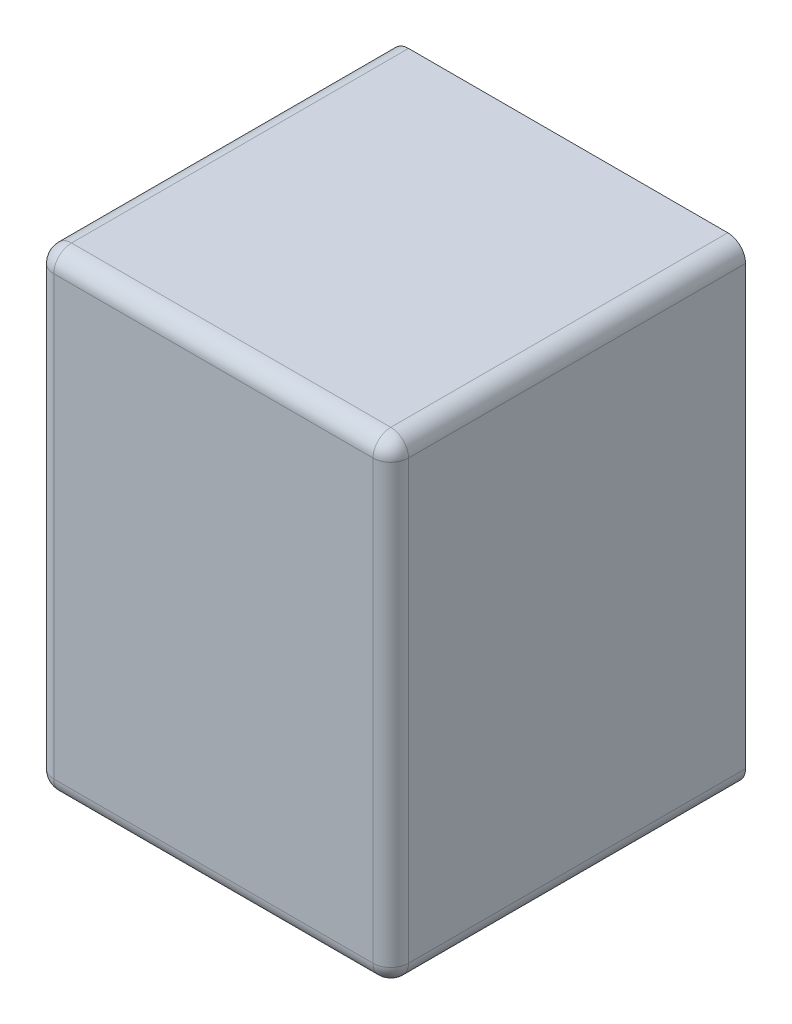
ISO-10303-21;
HEADER;
FILE_DESCRIPTION(('STEP AP214'),'2;1');
FILE_NAME('part.step','',(''),(''),'','','');
FILE_SCHEMA(('AUTOMOTIVE_DESIGN { 1 0 10303 214 1 1 1 1 }'));
ENDSEC;
DATA;
#1=APPLICATION_CONTEXT('core data for automotive mechanical design processes');
#2=APPLICATION_PROTOCOL_DEFINITION('international standard','automotive_design',2000,#1);
#3=PRODUCT_CONTEXT('',#1,'mechanical');
#4=PRODUCT('Part','Part','',(#3));
#5=PRODUCT_RELATED_PRODUCT_CATEGORY('part','',(#4));
#6=PRODUCT_DEFINITION_FORMATION('','',#4);
#7=PRODUCT_DEFINITION_CONTEXT('part definition',#1,'design');
#8=PRODUCT_DEFINITION('design','',#6,#7);
#9=PRODUCT_DEFINITION_SHAPE('','',#8);
#10=(LENGTH_UNIT() NAMED_UNIT(*) SI_UNIT(.MILLI.,.METRE.));
#11=(NAMED_UNIT(*) PLANE_ANGLE_UNIT() SI_UNIT($,.RADIAN.));
#12=(NAMED_UNIT(*) SI_UNIT($,.STERADIAN.) SOLID_ANGLE_UNIT());
#13=UNCERTAINTY_MEASURE_WITH_UNIT(LENGTH_MEASURE(1.E-05),#10,'distance_accuracy_value','');
#14=(GEOMETRIC_REPRESENTATION_CONTEXT(3) GLOBAL_UNCERTAINTY_ASSIGNED_CONTEXT((#13)) GLOBAL_UNIT_ASSIGNED_CONTEXT((#10,
#11,#12)) REPRESENTATION_CONTEXT('',''));
#15=CARTESIAN_POINT('',(0.,0.,0.));
#16=DIRECTION('',(0.,0.,1.));
#17=DIRECTION('',(1.,0.,0.));
#18=AXIS2_PLACEMENT_3D('',#15,#16,#17);
#19=CARTESIAN_POINT('',(1.35,-1.85,2.85));
#20=DIRECTION('',(0.,-1.,0.));
#21=DIRECTION('',(-1.,0.,0.));
#22=AXIS2_PLACEMENT_3D('',#19,#20,#21);
#23=SPHERICAL_SURFACE('',#22,0.15);
#24=CARTESIAN_POINT('',(1.35,-1.85,2.85));
#25=DIRECTION('',(0.,1.,0.));
#26=DIRECTION('',(0.,0.,1.));
#27=AXIS2_PLACEMENT_3D('',#24,#25,#26);
#28=CIRCLE('',#27,0.15);
#29=CARTESIAN_POINT('',(1.35,-1.85,3.));
#30=VERTEX_POINT('',#29);
#31=CARTESIAN_POINT('',(1.5,-1.85,2.84999999999923));
#32=VERTEX_POINT('',#31);
#33=EDGE_CURVE('E138',#30,#32,#28,.T.);
#34=ORIENTED_EDGE('',*,*,#33,.F.);
#35=CARTESIAN_POINT('',(1.35,-1.85,2.85));
#36=DIRECTION('',(1.,0.,0.));
#37=DIRECTION('',(0.,0.,-1.));
#38=AXIS2_PLACEMENT_3D('',#35,#36,#37);
#39=CIRCLE('',#38,0.15);
#40=CARTESIAN_POINT('',(1.35,-2.,2.85));
#41=VERTEX_POINT('',#40);
#42=EDGE_CURVE('E188',#41,#30,#39,.F.);
#43=ORIENTED_EDGE('',*,*,#42,.F.);
#44=CARTESIAN_POINT('',(1.35,-1.85,2.85));
#45=DIRECTION('',(0.,0.,1.));
#46=DIRECTION('',(1.,0.,0.));
#47=AXIS2_PLACEMENT_3D('',#44,#45,#46);
#48=CIRCLE('',#47,0.15);
#49=EDGE_CURVE('E97',#32,#41,#48,.F.);
#50=ORIENTED_EDGE('',*,*,#49,.F.);
#51=EDGE_LOOP('',(#34,#43,#50));
#52=FACE_BOUND('',#51,.T.);
#53=ADVANCED_FACE('F17',(#52),#23,.T.);
#54=CARTESIAN_POINT('',(1.5,-2.,0.));
#55=DIRECTION('',(1.,0.,0.));
#56=DIRECTION('',(0.,0.,-1.));
#57=AXIS2_PLACEMENT_3D('',#54,#55,#56);
#58=PLANE('',#57);
#59=DIRECTION('',(0.,0.,1.));
#60=VECTOR('',#59,1.);
#61=CARTESIAN_POINT('',(1.5,1.85,0.));
#62=LINE('',#61,#60);
#63=CARTESIAN_POINT('',(1.5,1.85,2.85));
#64=VERTEX_POINT('',#63);
#65=CARTESIAN_POINT('',(1.5,1.85,0.));
#66=VERTEX_POINT('',#65);
#67=EDGE_CURVE('E131',#64,#66,#62,.F.);
#68=ORIENTED_EDGE('',*,*,#67,.F.);
#69=DIRECTION('',(0.,1.,0.));
#70=VECTOR('',#69,1.);
#71=CARTESIAN_POINT('',(1.5,-1.85,2.85));
#72=LINE('',#71,#70);
#73=EDGE_CURVE('E134',#32,#64,#72,.T.);
#74=ORIENTED_EDGE('',*,*,#73,.F.);
#75=DIRECTION('',(0.,0.,1.));
#76=VECTOR('',#75,1.);
#77=CARTESIAN_POINT('',(1.5,-1.85,0.));
#78=LINE('',#77,#76);
#79=CARTESIAN_POINT('',(1.5,-1.85,0.));
#80=VERTEX_POINT('',#79);
#81=EDGE_CURVE('E129',#80,#32,#78,.T.);
#82=ORIENTED_EDGE('',*,*,#81,.F.);
#83=DIRECTION('',(0.,1.,0.));
#84=VECTOR('',#83,1.);
#85=CARTESIAN_POINT('',(1.5,-2.,0.));
#86=LINE('',#85,#84);
#87=EDGE_CURVE('E118',#80,#66,#86,.T.);
#88=ORIENTED_EDGE('',*,*,#87,.T.);
#89=EDGE_LOOP('',(#68,#74,#82,#88));
#90=FACE_BOUND('',#89,.T.);
#91=ADVANCED_FACE('F215',(#90),#58,.T.);
#92=CARTESIAN_POINT('',(1.35,1.85,2.85));
#93=DIRECTION('',(1.,0.,0.));
#94=DIRECTION('',(0.,-1.,0.));
#95=AXIS2_PLACEMENT_3D('',#92,#93,#94);
#96=SPHERICAL_SURFACE('',#95,0.15);
#97=CARTESIAN_POINT('',(1.35,1.85,2.85));
#98=DIRECTION('',(-1.,0.,0.));
#99=DIRECTION('',(0.,0.,1.));
#100=AXIS2_PLACEMENT_3D('',#97,#98,#99);
#101=CIRCLE('',#100,0.15);
#102=CARTESIAN_POINT('',(1.35,1.85,3.));
#103=VERTEX_POINT('',#102);
#104=CARTESIAN_POINT('',(1.35,2.,2.84999999999847));
#105=VERTEX_POINT('',#104);
#106=EDGE_CURVE('E182',#103,#105,#101,.T.);
#107=ORIENTED_EDGE('',*,*,#106,.F.);
#108=CARTESIAN_POINT('',(1.35,1.85,2.85));
#109=DIRECTION('',(0.,1.,0.));
#110=DIRECTION('',(0.,0.,1.));
#111=AXIS2_PLACEMENT_3D('',#108,#109,#110);
#112=CIRCLE('',#111,0.15);
#113=EDGE_CURVE('E137',#64,#103,#112,.F.);
#114=ORIENTED_EDGE('',*,*,#113,.F.);
#115=CARTESIAN_POINT('',(1.35,1.85,2.85));
#116=DIRECTION('',(0.,0.,1.));
#117=DIRECTION('',(1.,0.,0.));
#118=AXIS2_PLACEMENT_3D('',#115,#116,#117);
#119=CIRCLE('',#118,0.15);
#120=EDGE_CURVE('E142',#105,#64,#119,.F.);
#121=ORIENTED_EDGE('',*,*,#120,.F.);
#122=EDGE_LOOP('',(#107,#114,#121));
#123=FACE_BOUND('',#122,.T.);
#124=ADVANCED_FACE('F212',(#123),#96,.T.);
#125=CARTESIAN_POINT('',(1.35,-1.85,0.));
#126=DIRECTION('',(0.,0.,1.));
#127=DIRECTION('',(1.,0.,0.));
#128=AXIS2_PLACEMENT_3D('',#125,#126,#127);
#129=CYLINDRICAL_SURFACE('',#128,0.15);
#130=DIRECTION('',(0.,0.,1.));
#131=VECTOR('',#130,1.);
#132=CARTESIAN_POINT('',(1.35,-2.,0.));
#133=LINE('',#132,#131);
#134=CARTESIAN_POINT('',(1.35,-2.,0.));
#135=VERTEX_POINT('',#134);
#136=EDGE_CURVE('E92',#41,#135,#133,.F.);
#137=ORIENTED_EDGE('',*,*,#136,.T.);
#138=CARTESIAN_POINT('',(1.35,-1.85,0.));
#139=DIRECTION('',(0.,0.,1.));
#140=DIRECTION('',(1.,0.,0.));
#141=AXIS2_PLACEMENT_3D('',#138,#139,#140);
#142=CIRCLE('',#141,0.15);
#143=EDGE_CURVE('E21',#135,#80,#142,.T.);
#144=ORIENTED_EDGE('',*,*,#143,.T.);
#145=ORIENTED_EDGE('',*,*,#81,.T.);
#146=ORIENTED_EDGE('',*,*,#49,.T.);
#147=EDGE_LOOP('',(#137,#144,#145,#146));
#148=FACE_BOUND('',#147,.T.);
#149=ADVANCED_FACE('F94',(#148),#129,.T.);
#150=CARTESIAN_POINT('',(1.35,1.85,0.));
#151=DIRECTION('',(0.,0.,1.));
#152=DIRECTION('',(1.,0.,0.));
#153=AXIS2_PLACEMENT_3D('',#150,#151,#152);
#154=CYLINDRICAL_SURFACE('',#153,0.15);
#155=DIRECTION('',(0.,0.,1.));
#156=VECTOR('',#155,1.);
#157=CARTESIAN_POINT('',(1.35,2.,0.));
#158=LINE('',#157,#156);
#159=CARTESIAN_POINT('',(1.35,2.,0.));
#160=VERTEX_POINT('',#159);
#161=EDGE_CURVE('E149',#105,#160,#158,.F.);
#162=ORIENTED_EDGE('',*,*,#161,.F.);
#163=ORIENTED_EDGE('',*,*,#120,.T.);
#164=ORIENTED_EDGE('',*,*,#67,.T.);
#165=CARTESIAN_POINT('',(1.35,1.85,0.));
#166=DIRECTION('',(0.,0.,1.));
#167=DIRECTION('',(1.,0.,0.));
#168=AXIS2_PLACEMENT_3D('',#165,#166,#167);
#169=CIRCLE('',#168,0.15);
#170=EDGE_CURVE('E119',#66,#160,#169,.T.);
#171=ORIENTED_EDGE('',*,*,#170,.T.);
#172=EDGE_LOOP('',(#162,#163,#164,#171));
#173=FACE_BOUND('',#172,.T.);
#174=ADVANCED_FACE('F277',(#173),#154,.T.);
#175=CARTESIAN_POINT('',(-1.35,-1.85,2.85));
#176=DIRECTION('',(1.,0.,0.));
#177=DIRECTION('',(0.,0.,-1.));
#178=AXIS2_PLACEMENT_3D('',#175,#176,#177);
#179=CYLINDRICAL_SURFACE('',#178,0.15);
#180=ORIENTED_EDGE('',*,*,#42,.T.);
#181=DIRECTION('',(1.,0.,0.));
#182=VECTOR('',#181,1.);
#183=CARTESIAN_POINT('',(-1.5,-1.85,3.));
#184=LINE('',#183,#182);
#185=CARTESIAN_POINT('',(-1.35,-1.85,3.));
#186=VERTEX_POINT('',#185);
#187=EDGE_CURVE('E203',#186,#30,#184,.T.);
#188=ORIENTED_EDGE('',*,*,#187,.F.);
#189=CARTESIAN_POINT('',(-1.35,-1.85,2.85));
#190=DIRECTION('',(-1.,0.,0.));
#191=DIRECTION('',(0.,1.,0.));
#192=AXIS2_PLACEMENT_3D('',#189,#190,#191);
#193=CIRCLE('',#192,0.15);
#194=CARTESIAN_POINT('',(-1.35,-2.,2.84999999999962));
#195=VERTEX_POINT('',#194);
#196=EDGE_CURVE('E201',#195,#186,#193,.T.);
#197=ORIENTED_EDGE('',*,*,#196,.F.);
#198=DIRECTION('',(1.,0.,0.));
#199=VECTOR('',#198,1.);
#200=CARTESIAN_POINT('',(-1.5,-2.,2.85));
#201=LINE('',#200,#199);
#202=EDGE_CURVE('E102',#195,#41,#201,.T.);
#203=ORIENTED_EDGE('',*,*,#202,.T.);
#204=EDGE_LOOP('',(#180,#188,#197,#203));
#205=FACE_BOUND('',#204,.T.);
#206=ADVANCED_FACE('F290',(#205),#179,.T.);
#207=CARTESIAN_POINT('',(1.35,-1.85,2.85));
#208=DIRECTION('',(0.,1.,0.));
#209=DIRECTION('',(0.,0.,1.));
#210=AXIS2_PLACEMENT_3D('',#207,#208,#209);
#211=CYLINDRICAL_SURFACE('',#210,0.15);
#212=ORIENTED_EDGE('',*,*,#113,.T.);
#213=DIRECTION('',(0.,1.,0.));
#214=VECTOR('',#213,1.);
#215=CARTESIAN_POINT('',(1.35,-2.,3.));
#216=LINE('',#215,#214);
#217=EDGE_CURVE('E285',#30,#103,#216,.T.);
#218=ORIENTED_EDGE('',*,*,#217,.F.);
#219=ORIENTED_EDGE('',*,*,#33,.T.);
#220=ORIENTED_EDGE('',*,*,#73,.T.);
#221=EDGE_LOOP('',(#212,#218,#219,#220));
#222=FACE_BOUND('',#221,.T.);
#223=ADVANCED_FACE('F283',(#222),#211,.T.);
#224=CARTESIAN_POINT('',(1.35,1.85,2.85));
#225=DIRECTION('',(-1.,0.,0.));
#226=DIRECTION('',(0.,0.,1.));
#227=AXIS2_PLACEMENT_3D('',#224,#225,#226);
#228=CYLINDRICAL_SURFACE('',#227,0.15);
#229=CARTESIAN_POINT('',(-1.35,1.85,2.85));
#230=DIRECTION('',(1.,0.,0.));
#231=DIRECTION('',(0.,1.,0.));
#232=AXIS2_PLACEMENT_3D('',#229,#230,#231);
#233=CIRCLE('',#232,0.15);
#234=CARTESIAN_POINT('',(-1.35,1.85,3.));
#235=VERTEX_POINT('',#234);
#236=CARTESIAN_POINT('',(-1.35,2.,2.85));
#237=VERTEX_POINT('',#236);
#238=EDGE_CURVE('E148',#235,#237,#233,.F.);
#239=ORIENTED_EDGE('',*,*,#238,.F.);
#240=DIRECTION('',(1.,0.,0.));
#241=VECTOR('',#240,1.);
#242=CARTESIAN_POINT('',(-1.5,1.85,3.));
#243=LINE('',#242,#241);
#244=EDGE_CURVE('E179',#103,#235,#243,.F.);
#245=ORIENTED_EDGE('',*,*,#244,.F.);
#246=ORIENTED_EDGE('',*,*,#106,.T.);
#247=DIRECTION('',(1.,0.,0.));
#248=VECTOR('',#247,1.);
#249=CARTESIAN_POINT('',(-1.5,2.,2.85));
#250=LINE('',#249,#248);
#251=EDGE_CURVE('E257',#237,#105,#250,.T.);
#252=ORIENTED_EDGE('',*,*,#251,.F.);
#253=EDGE_LOOP('',(#239,#245,#246,#252));
#254=FACE_BOUND('',#253,.T.);
#255=ADVANCED_FACE('F271',(#254),#228,.T.);
#256=CARTESIAN_POINT('',(-1.5,-2.,0.));
#257=DIRECTION('',(0.,1.,0.));
#258=DIRECTION('',(0.,0.,1.));
#259=AXIS2_PLACEMENT_3D('',#256,#257,#258);
#260=PLANE('',#259);
#261=DIRECTION('',(0.,0.,1.));
#262=VECTOR('',#261,1.);
#263=CARTESIAN_POINT('',(-1.35,-2.,0.));
#264=LINE('',#263,#262);
#265=CARTESIAN_POINT('',(-1.35,-2.,0.));
#266=VERTEX_POINT('',#265);
#267=EDGE_CURVE('E108',#266,#195,#264,.T.);
#268=ORIENTED_EDGE('',*,*,#267,.F.);
#269=DIRECTION('',(1.,0.,0.));
#270=VECTOR('',#269,1.);
#271=CARTESIAN_POINT('',(-1.5,-2.,0.));
#272=LINE('',#271,#270);
#273=EDGE_CURVE('E105',#266,#135,#272,.T.);
#274=ORIENTED_EDGE('',*,*,#273,.T.);
#275=ORIENTED_EDGE('',*,*,#136,.F.);
#276=ORIENTED_EDGE('',*,*,#202,.F.);
#277=EDGE_LOOP('',(#268,#274,#275,#276));
#278=FACE_BOUND('',#277,.T.);
#279=ADVANCED_FACE('F106',(#278),#260,.F.);
#280=CARTESIAN_POINT('',(-1.5,-2.,0.));
#281=DIRECTION('',(0.,0.,1.));
#282=DIRECTION('',(1.,0.,0.));
#283=AXIS2_PLACEMENT_3D('',#280,#281,#282);
#284=PLANE('',#283);
#285=DIRECTION('',(1.,0.,0.));
#286=VECTOR('',#285,1.);
#287=CARTESIAN_POINT('',(-1.5,2.,0.));
#288=LINE('',#287,#286);
#289=CARTESIAN_POINT('',(-1.35,2.,0.));
#290=VERTEX_POINT('',#289);
#291=EDGE_CURVE('E112',#160,#290,#288,.F.);
#292=ORIENTED_EDGE('',*,*,#291,.F.);
#293=ORIENTED_EDGE('',*,*,#170,.F.);
#294=ORIENTED_EDGE('',*,*,#87,.F.);
#295=ORIENTED_EDGE('',*,*,#143,.F.);
#296=ORIENTED_EDGE('',*,*,#273,.F.);
#297=CARTESIAN_POINT('',(-1.35,-1.85,0.));
#298=DIRECTION('',(0.,0.,1.));
#299=DIRECTION('',(1.,0.,0.));
#300=AXIS2_PLACEMENT_3D('',#297,#298,#299);
#301=CIRCLE('',#300,0.15);
#302=CARTESIAN_POINT('',(-1.5,-1.85,0.));
#303=VERTEX_POINT('',#302);
#304=EDGE_CURVE('E101',#303,#266,#301,.T.);
#305=ORIENTED_EDGE('',*,*,#304,.F.);
#306=DIRECTION('',(0.,1.,0.));
#307=VECTOR('',#306,1.);
#308=CARTESIAN_POINT('',(-1.5,-2.,0.));
#309=LINE('',#308,#307);
#310=CARTESIAN_POINT('',(-1.5,1.85,0.));
#311=VERTEX_POINT('',#310);
#312=EDGE_CURVE('E158',#303,#311,#309,.T.);
#313=ORIENTED_EDGE('',*,*,#312,.T.);
#314=CARTESIAN_POINT('',(-1.35,1.85,0.));
#315=DIRECTION('',(0.,0.,1.));
#316=DIRECTION('',(1.,0.,0.));
#317=AXIS2_PLACEMENT_3D('',#314,#315,#316);
#318=CIRCLE('',#317,0.15);
#319=EDGE_CURVE('E145',#290,#311,#318,.T.);
#320=ORIENTED_EDGE('',*,*,#319,.F.);
#321=EDGE_LOOP('',(#292,#293,#294,#295,#296,#305,#313,#320));
#322=FACE_BOUND('',#321,.T.);
#323=ADVANCED_FACE('F115',(#322),#284,.F.);
#324=CARTESIAN_POINT('',(-1.5,2.,0.));
#325=DIRECTION('',(0.,1.,0.));
#326=DIRECTION('',(0.,0.,1.));
#327=AXIS2_PLACEMENT_3D('',#324,#325,#326);
#328=PLANE('',#327);
#329=ORIENTED_EDGE('',*,*,#291,.T.);
#330=DIRECTION('',(0.,0.,1.));
#331=VECTOR('',#330,1.);
#332=CARTESIAN_POINT('',(-1.35,2.,0.));
#333=LINE('',#332,#331);
#334=EDGE_CURVE('E168',#237,#290,#333,.F.);
#335=ORIENTED_EDGE('',*,*,#334,.F.);
#336=ORIENTED_EDGE('',*,*,#251,.T.);
#337=ORIENTED_EDGE('',*,*,#161,.T.);
#338=EDGE_LOOP('',(#329,#335,#336,#337));
#339=FACE_BOUND('',#338,.T.);
#340=ADVANCED_FACE('F265',(#339),#328,.T.);
#341=CARTESIAN_POINT('',(-1.35,1.85,2.85));
#342=DIRECTION('',(0.,1.,0.));
#343=DIRECTION('',(1.,0.,0.));
#344=AXIS2_PLACEMENT_3D('',#341,#342,#343);
#345=SPHERICAL_SURFACE('',#344,0.15);
#346=CARTESIAN_POINT('',(-1.35,1.85,2.85));
#347=DIRECTION('',(0.,-1.,0.));
#348=DIRECTION('',(0.,0.,-1.));
#349=AXIS2_PLACEMENT_3D('',#346,#347,#348);
#350=CIRCLE('',#349,0.15);
#351=CARTESIAN_POINT('',(-1.5,1.85,2.84999999999847));
#352=VERTEX_POINT('',#351);
#353=EDGE_CURVE('E35',#235,#352,#350,.T.);
#354=ORIENTED_EDGE('',*,*,#353,.F.);
#355=ORIENTED_EDGE('',*,*,#238,.T.);
#356=CARTESIAN_POINT('',(-1.35,1.85,2.85));
#357=DIRECTION('',(0.,0.,1.));
#358=DIRECTION('',(1.,0.,0.));
#359=AXIS2_PLACEMENT_3D('',#356,#357,#358);
#360=CIRCLE('',#359,0.15);
#361=EDGE_CURVE('E164',#352,#237,#360,.F.);
#362=ORIENTED_EDGE('',*,*,#361,.F.);
#363=EDGE_LOOP('',(#354,#355,#362));
#364=FACE_BOUND('',#363,.T.);
#365=ADVANCED_FACE('F246',(#364),#345,.T.);
#366=CARTESIAN_POINT('',(-1.35,-1.85,2.85));
#367=DIRECTION('',(-1.,0.,0.));
#368=DIRECTION('',(0.,1.,0.));
#369=AXIS2_PLACEMENT_3D('',#366,#367,#368);
#370=SPHERICAL_SURFACE('',#369,0.15);
#371=ORIENTED_EDGE('',*,*,#196,.T.);
#372=CARTESIAN_POINT('',(-1.35,-1.85,2.85));
#373=DIRECTION('',(0.,-1.,0.));
#374=DIRECTION('',(0.,0.,-1.));
#375=AXIS2_PLACEMENT_3D('',#372,#373,#374);
#376=CIRCLE('',#375,0.15);
#377=CARTESIAN_POINT('',(-1.5,-1.85,2.85));
#378=VERTEX_POINT('',#377);
#379=EDGE_CURVE('E297',#378,#186,#376,.F.);
#380=ORIENTED_EDGE('',*,*,#379,.F.);
#381=CARTESIAN_POINT('',(-1.35,-1.85,2.85));
#382=DIRECTION('',(0.,0.,1.));
#383=DIRECTION('',(1.,0.,0.));
#384=AXIS2_PLACEMENT_3D('',#381,#382,#383);
#385=CIRCLE('',#384,0.15);
#386=EDGE_CURVE('E165',#195,#378,#385,.F.);
#387=ORIENTED_EDGE('',*,*,#386,.F.);
#388=EDGE_LOOP('',(#371,#380,#387));
#389=FACE_BOUND('',#388,.T.);
#390=ADVANCED_FACE('F241',(#389),#370,.T.);
#391=CARTESIAN_POINT('',(-1.5,-2.,3.));
#392=DIRECTION('',(0.,0.,1.));
#393=DIRECTION('',(1.,0.,0.));
#394=AXIS2_PLACEMENT_3D('',#391,#392,#393);
#395=PLANE('',#394);
#396=ORIENTED_EDGE('',*,*,#244,.T.);
#397=DIRECTION('',(0.,-1.,0.));
#398=VECTOR('',#397,1.);
#399=CARTESIAN_POINT('',(-1.35,1.85,3.));
#400=LINE('',#399,#398);
#401=EDGE_CURVE('E175',#186,#235,#400,.F.);
#402=ORIENTED_EDGE('',*,*,#401,.F.);
#403=ORIENTED_EDGE('',*,*,#187,.T.);
#404=ORIENTED_EDGE('',*,*,#217,.T.);
#405=EDGE_LOOP('',(#396,#402,#403,#404));
#406=FACE_BOUND('',#405,.T.);
#407=ADVANCED_FACE('F238',(#406),#395,.T.);
#408=CARTESIAN_POINT('',(-1.35,-1.85,0.));
#409=DIRECTION('',(0.,0.,1.));
#410=DIRECTION('',(1.,0.,0.));
#411=AXIS2_PLACEMENT_3D('',#408,#409,#410);
#412=CYLINDRICAL_SURFACE('',#411,0.15);
#413=ORIENTED_EDGE('',*,*,#267,.T.);
#414=ORIENTED_EDGE('',*,*,#386,.T.);
#415=DIRECTION('',(0.,0.,-1.));
#416=VECTOR('',#415,1.);
#417=CARTESIAN_POINT('',(-1.5,-1.85,0.));
#418=LINE('',#417,#416);
#419=EDGE_CURVE('E154',#378,#303,#418,.T.);
#420=ORIENTED_EDGE('',*,*,#419,.T.);
#421=ORIENTED_EDGE('',*,*,#304,.T.);
#422=EDGE_LOOP('',(#413,#414,#420,#421));
#423=FACE_BOUND('',#422,.T.);
#424=ADVANCED_FACE('F151',(#423),#412,.T.);
#425=CARTESIAN_POINT('',(-1.35,1.85,0.));
#426=DIRECTION('',(0.,0.,1.));
#427=DIRECTION('',(1.,0.,0.));
#428=AXIS2_PLACEMENT_3D('',#425,#426,#427);
#429=CYLINDRICAL_SURFACE('',#428,0.15);
#430=ORIENTED_EDGE('',*,*,#334,.T.);
#431=ORIENTED_EDGE('',*,*,#319,.T.);
#432=DIRECTION('',(0.,0.,-1.));
#433=VECTOR('',#432,1.);
#434=CARTESIAN_POINT('',(-1.5,1.85,0.));
#435=LINE('',#434,#433);
#436=EDGE_CURVE('E27',#311,#352,#435,.F.);
#437=ORIENTED_EDGE('',*,*,#436,.T.);
#438=ORIENTED_EDGE('',*,*,#361,.T.);
#439=EDGE_LOOP('',(#430,#431,#437,#438));
#440=FACE_BOUND('',#439,.T.);
#441=ADVANCED_FACE('F230',(#440),#429,.T.);
#442=CARTESIAN_POINT('',(-1.35,1.85,2.85));
#443=DIRECTION('',(0.,-1.,0.));
#444=DIRECTION('',(0.,0.,-1.));
#445=AXIS2_PLACEMENT_3D('',#442,#443,#444);
#446=CYLINDRICAL_SURFACE('',#445,0.15);
#447=ORIENTED_EDGE('',*,*,#379,.T.);
#448=ORIENTED_EDGE('',*,*,#401,.T.);
#449=ORIENTED_EDGE('',*,*,#353,.T.);
#450=DIRECTION('',(0.,1.,0.));
#451=VECTOR('',#450,1.);
#452=CARTESIAN_POINT('',(-1.5,-2.,2.85));
#453=LINE('',#452,#451);
#454=EDGE_CURVE('E11',#352,#378,#453,.F.);
#455=ORIENTED_EDGE('',*,*,#454,.T.);
#456=EDGE_LOOP('',(#447,#448,#449,#455));
#457=FACE_BOUND('',#456,.T.);
#458=ADVANCED_FACE('F225',(#457),#446,.T.);
#459=CARTESIAN_POINT('',(-1.5,-2.,0.));
#460=DIRECTION('',(1.,0.,0.));
#461=DIRECTION('',(0.,0.,-1.));
#462=AXIS2_PLACEMENT_3D('',#459,#460,#461);
#463=PLANE('',#462);
#464=ORIENTED_EDGE('',*,*,#436,.F.);
#465=ORIENTED_EDGE('',*,*,#312,.F.);
#466=ORIENTED_EDGE('',*,*,#419,.F.);
#467=ORIENTED_EDGE('',*,*,#454,.F.);
#468=EDGE_LOOP('',(#464,#465,#466,#467));
#469=FACE_BOUND('',#468,.T.);
#470=ADVANCED_FACE('F160',(#469),#463,.F.);
#471=CLOSED_SHELL('',(#53,#91,#124,#149,#174,#206,#223,#255,#279,#323,#340,#365,#390,#407,#424,
#441,#458,#470));
#472=MANIFOLD_SOLID_BREP('B1',#471);
#473=ADVANCED_BREP_SHAPE_REPRESENTATION('',(#18,#472),#14);
#474=SHAPE_DEFINITION_REPRESENTATION(#9,#473);
ENDSEC;
END-ISO-10303-21;
